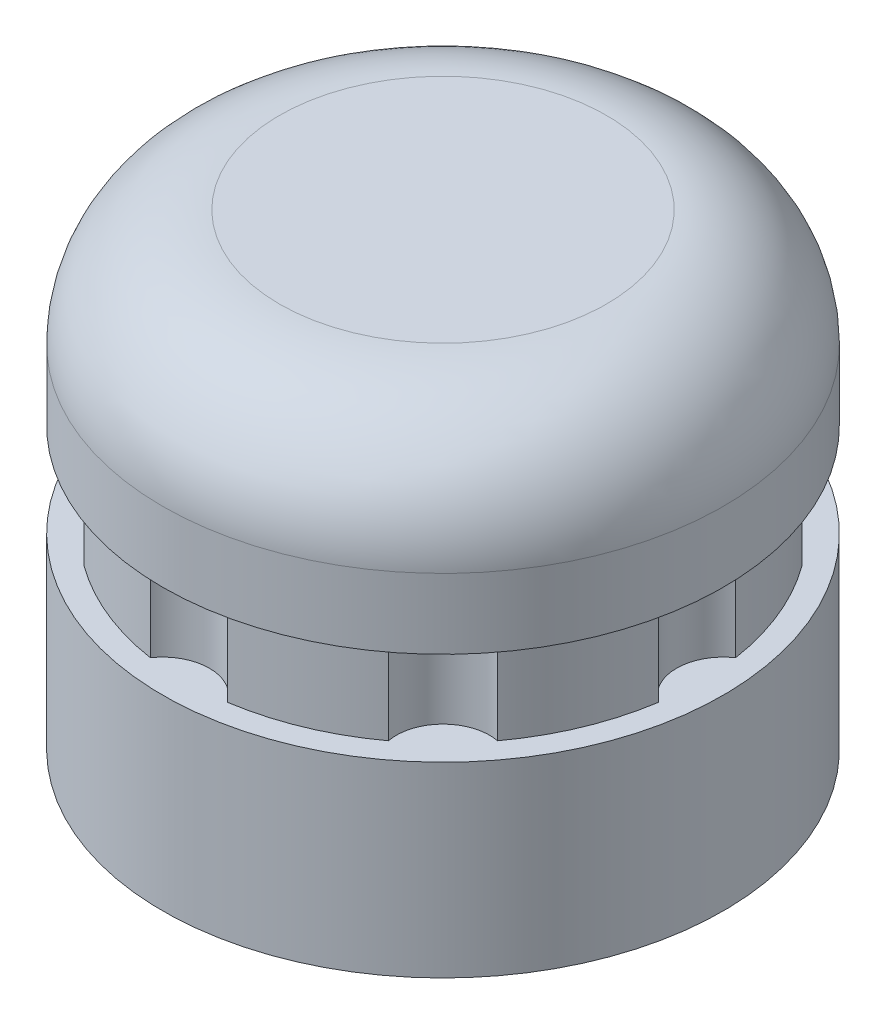
ISO-10303-21;
HEADER;
FILE_DESCRIPTION(('STEP AP214'),'2;1');
FILE_NAME('part.step','',(''),(''),'','','');
FILE_SCHEMA(('AUTOMOTIVE_DESIGN { 1 0 10303 214 1 1 1 1 }'));
ENDSEC;
DATA;
#1=APPLICATION_CONTEXT('core data for automotive mechanical design processes');
#2=APPLICATION_PROTOCOL_DEFINITION('international standard','automotive_design',2000,#1);
#3=PRODUCT_CONTEXT('',#1,'mechanical');
#4=PRODUCT('Part','Part','',(#3));
#5=PRODUCT_RELATED_PRODUCT_CATEGORY('part','',(#4));
#6=PRODUCT_DEFINITION_FORMATION('','',#4);
#7=PRODUCT_DEFINITION_CONTEXT('part definition',#1,'design');
#8=PRODUCT_DEFINITION('design','',#6,#7);
#9=PRODUCT_DEFINITION_SHAPE('','',#8);
#10=(LENGTH_UNIT() NAMED_UNIT(*) SI_UNIT(.MILLI.,.METRE.));
#11=(NAMED_UNIT(*) PLANE_ANGLE_UNIT() SI_UNIT($,.RADIAN.));
#12=(NAMED_UNIT(*) SI_UNIT($,.STERADIAN.) SOLID_ANGLE_UNIT());
#13=UNCERTAINTY_MEASURE_WITH_UNIT(LENGTH_MEASURE(1.E-05),#10,'distance_accuracy_value','');
#14=(GEOMETRIC_REPRESENTATION_CONTEXT(3) GLOBAL_UNCERTAINTY_ASSIGNED_CONTEXT((#13)) GLOBAL_UNIT_ASSIGNED_CONTEXT((#10,
#11,#12)) REPRESENTATION_CONTEXT('',''));
#15=CARTESIAN_POINT('',(0.,0.,0.));
#16=DIRECTION('',(0.,0.,1.));
#17=DIRECTION('',(1.,0.,0.));
#18=AXIS2_PLACEMENT_3D('',#15,#16,#17);
#19=CARTESIAN_POINT('',(0.,4.,0.));
#20=DIRECTION('',(0.,-1.,0.));
#21=DIRECTION('',(0.,0.,-1.));
#22=AXIS2_PLACEMENT_3D('',#19,#20,#21);
#23=PLANE('',#22);
#24=DIRECTION('',(0.,0.,1.));
#25=VECTOR('',#24,1.);
#26=CARTESIAN_POINT('',(1.5,4.,2.));
#27=LINE('',#26,#25);
#28=CARTESIAN_POINT('',(1.5,4.,-2.));
#29=VERTEX_POINT('',#28);
#30=CARTESIAN_POINT('',(1.5,4.,2.));
#31=VERTEX_POINT('',#30);
#32=EDGE_CURVE('E198',#29,#31,#27,.T.);
#33=ORIENTED_EDGE('',*,*,#32,.F.);
#34=CARTESIAN_POINT('',(0.,4.,0.));
#35=DIRECTION('',(0.,-1.,0.));
#36=DIRECTION('',(0.,0.,-1.));
#37=AXIS2_PLACEMENT_3D('',#34,#35,#36);
#38=CIRCLE('',#37,2.5);
#39=EDGE_CURVE('E180',#29,#31,#38,.T.);
#40=ORIENTED_EDGE('',*,*,#39,.T.);
#41=EDGE_LOOP('',(#33,#40));
#42=FACE_BOUND('',#41,.T.);
#43=ADVANCED_FACE('F34',(#42),#23,.T.);
#44=CARTESIAN_POINT('',(0.,20.,0.));
#45=DIRECTION('',(0.,-1.,0.));
#46=DIRECTION('',(0.,0.,-1.));
#47=AXIS2_PLACEMENT_3D('',#44,#45,#46);
#48=CYLINDRICAL_SURFACE('',#47,11.);
#49=CARTESIAN_POINT('',(0.,12.,0.));
#50=DIRECTION('',(0.,1.,0.));
#51=DIRECTION('',(0.,0.,1.));
#52=AXIS2_PLACEMENT_3D('',#49,#50,#51);
#53=CIRCLE('',#52,11.);
#54=CARTESIAN_POINT('',(-6.52051831203686,12.,8.85905417877055));
#55=VERTEX_POINT('',#54);
#56=CARTESIAN_POINT('',(-1.65359456941537,12.,10.875));
#57=VERTEX_POINT('',#56);
#58=EDGE_CURVE('E288',#55,#57,#53,.T.);
#59=ORIENTED_EDGE('',*,*,#58,.F.);
#60=DIRECTION('',(0.,-1.,0.));
#61=VECTOR('',#60,1.);
#62=CARTESIAN_POINT('',(-6.52051831203686,20.,8.85905417877055));
#63=LINE('',#62,#61);
#64=CARTESIAN_POINT('',(-6.52051831203686,8.,8.85905417877055));
#65=VERTEX_POINT('',#64);
#66=EDGE_CURVE('E341',#55,#65,#63,.T.);
#67=ORIENTED_EDGE('',*,*,#66,.T.);
#68=CARTESIAN_POINT('',(0.,8.,0.));
#69=DIRECTION('',(0.,-1.,0.));
#70=DIRECTION('',(0.,0.,-1.));
#71=AXIS2_PLACEMENT_3D('',#68,#69,#70);
#72=CIRCLE('',#71,11.);
#73=CARTESIAN_POINT('',(-1.65359456941537,8.,10.875));
#74=VERTEX_POINT('',#73);
#75=EDGE_CURVE('E338',#74,#65,#72,.T.);
#76=ORIENTED_EDGE('',*,*,#75,.F.);
#77=DIRECTION('',(0.,-1.,0.));
#78=VECTOR('',#77,1.);
#79=CARTESIAN_POINT('',(-1.65359456941537,20.,10.875));
#80=LINE('',#79,#78);
#81=EDGE_CURVE('E223',#57,#74,#80,.T.);
#82=ORIENTED_EDGE('',*,*,#81,.F.);
#83=EDGE_LOOP('',(#59,#67,#76,#82));
#84=FACE_BOUND('',#83,.T.);
#85=ADVANCED_FACE('F383',(#84),#48,.T.);
#86=CARTESIAN_POINT('',(0.,20.,12.));
#87=DIRECTION('',(0.,-1.,0.));
#88=DIRECTION('',(0.,0.,-1.));
#89=AXIS2_PLACEMENT_3D('',#86,#87,#88);
#90=CYLINDRICAL_SURFACE('',#89,2.);
#91=DIRECTION('',(0.,-1.,0.));
#92=VECTOR('',#91,1.);
#93=CARTESIAN_POINT('',(1.65359456941537,20.,10.875));
#94=LINE('',#93,#92);
#95=CARTESIAN_POINT('',(1.65359456941537,12.,10.875));
#96=VERTEX_POINT('',#95);
#97=CARTESIAN_POINT('',(1.65359456941537,8.,10.875));
#98=VERTEX_POINT('',#97);
#99=EDGE_CURVE('E369',#96,#98,#94,.T.);
#100=ORIENTED_EDGE('',*,*,#99,.F.);
#101=CARTESIAN_POINT('',(0.,12.,12.));
#102=DIRECTION('',(0.,1.,0.));
#103=DIRECTION('',(0.,0.,1.));
#104=AXIS2_PLACEMENT_3D('',#101,#102,#103);
#105=CIRCLE('',#104,2.);
#106=EDGE_CURVE('E285',#96,#57,#105,.T.);
#107=ORIENTED_EDGE('',*,*,#106,.T.);
#108=ORIENTED_EDGE('',*,*,#81,.T.);
#109=CARTESIAN_POINT('',(0.,8.,12.));
#110=DIRECTION('',(0.,-1.,0.));
#111=DIRECTION('',(0.,0.,-1.));
#112=AXIS2_PLACEMENT_3D('',#109,#110,#111);
#113=CIRCLE('',#112,2.);
#114=EDGE_CURVE('E335',#74,#98,#113,.T.);
#115=ORIENTED_EDGE('',*,*,#114,.T.);
#116=EDGE_LOOP('',(#100,#107,#108,#115));
#117=FACE_BOUND('',#116,.T.);
#118=ADVANCED_FACE('F374',(#117),#90,.F.);
#119=CARTESIAN_POINT('',(0.,12.,0.));
#120=DIRECTION('',(0.,1.,0.));
#121=DIRECTION('',(0.,0.,1.));
#122=AXIS2_PLACEMENT_3D('',#119,#120,#121);
#123=CIRCLE('',#122,11.);
#124=CARTESIAN_POINT('',(6.52051831203674,12.,8.85905417877064));
#125=VERTEX_POINT('',#124);
#126=EDGE_CURVE('E283',#96,#125,#123,.T.);
#127=ORIENTED_EDGE('',*,*,#126,.F.);
#128=ORIENTED_EDGE('',*,*,#99,.T.);
#129=CARTESIAN_POINT('',(0.,8.,0.));
#130=DIRECTION('',(0.,-1.,0.));
#131=DIRECTION('',(0.,0.,-1.));
#132=AXIS2_PLACEMENT_3D('',#129,#130,#131);
#133=CIRCLE('',#132,11.);
#134=CARTESIAN_POINT('',(6.52051831203674,8.,8.85905417877064));
#135=VERTEX_POINT('',#134);
#136=EDGE_CURVE('E332',#135,#98,#133,.T.);
#137=ORIENTED_EDGE('',*,*,#136,.F.);
#138=DIRECTION('',(0.,-1.,0.));
#139=VECTOR('',#138,1.);
#140=CARTESIAN_POINT('',(6.52051831203674,20.,8.85905417877064));
#141=LINE('',#140,#139);
#142=EDGE_CURVE('E367',#125,#135,#141,.T.);
#143=ORIENTED_EDGE('',*,*,#142,.F.);
#144=EDGE_LOOP('',(#127,#128,#137,#143));
#145=FACE_BOUND('',#144,.T.);
#146=ADVANCED_FACE('F439',(#145),#48,.T.);
#147=CARTESIAN_POINT('',(8.48528137423847,20.,8.48528137423868));
#148=DIRECTION('',(0.,-1.,0.));
#149=DIRECTION('',(0.,0.,-1.));
#150=AXIS2_PLACEMENT_3D('',#147,#148,#149);
#151=CYLINDRICAL_SURFACE('',#150,2.);
#152=DIRECTION('',(0.,-1.,0.));
#153=VECTOR('',#152,1.);
#154=CARTESIAN_POINT('',(8.85905417877048,20.,6.52051831203696));
#155=LINE('',#154,#153);
#156=CARTESIAN_POINT('',(8.85905417877048,12.,6.52051831203696));
#157=VERTEX_POINT('',#156);
#158=CARTESIAN_POINT('',(8.85905417877048,8.,6.52051831203696));
#159=VERTEX_POINT('',#158);
#160=EDGE_CURVE('E365',#157,#159,#155,.T.);
#161=ORIENTED_EDGE('',*,*,#160,.F.);
#162=CARTESIAN_POINT('',(8.48528137423847,12.,8.48528137423868));
#163=DIRECTION('',(0.,1.,0.));
#164=DIRECTION('',(0.,0.,1.));
#165=AXIS2_PLACEMENT_3D('',#162,#163,#164);
#166=CIRCLE('',#165,2.);
#167=EDGE_CURVE('E280',#157,#125,#166,.T.);
#168=ORIENTED_EDGE('',*,*,#167,.T.);
#169=ORIENTED_EDGE('',*,*,#142,.T.);
#170=CARTESIAN_POINT('',(8.48528137423847,8.,8.48528137423868));
#171=DIRECTION('',(0.,-1.,0.));
#172=DIRECTION('',(0.,0.,-1.));
#173=AXIS2_PLACEMENT_3D('',#170,#171,#172);
#174=CIRCLE('',#173,2.);
#175=EDGE_CURVE('E329',#135,#159,#174,.T.);
#176=ORIENTED_EDGE('',*,*,#175,.T.);
#177=EDGE_LOOP('',(#161,#168,#169,#176));
#178=FACE_BOUND('',#177,.T.);
#179=ADVANCED_FACE('F435',(#178),#151,.F.);
#180=CARTESIAN_POINT('',(0.,12.,0.));
#181=DIRECTION('',(0.,1.,0.));
#182=DIRECTION('',(0.,0.,1.));
#183=AXIS2_PLACEMENT_3D('',#180,#181,#182);
#184=CIRCLE('',#183,11.);
#185=CARTESIAN_POINT('',(10.875,12.,1.65359456941548));
#186=VERTEX_POINT('',#185);
#187=EDGE_CURVE('E278',#157,#186,#184,.T.);
#188=ORIENTED_EDGE('',*,*,#187,.F.);
#189=ORIENTED_EDGE('',*,*,#160,.T.);
#190=CARTESIAN_POINT('',(0.,8.,0.));
#191=DIRECTION('',(0.,-1.,0.));
#192=DIRECTION('',(0.,0.,-1.));
#193=AXIS2_PLACEMENT_3D('',#190,#191,#192);
#194=CIRCLE('',#193,11.);
#195=CARTESIAN_POINT('',(10.875,8.,1.65359456941548));
#196=VERTEX_POINT('',#195);
#197=EDGE_CURVE('E326',#196,#159,#194,.T.);
#198=ORIENTED_EDGE('',*,*,#197,.F.);
#199=DIRECTION('',(0.,-1.,0.));
#200=VECTOR('',#199,1.);
#201=CARTESIAN_POINT('',(10.875,20.,1.65359456941548));
#202=LINE('',#201,#200);
#203=EDGE_CURVE('E363',#186,#196,#202,.T.);
#204=ORIENTED_EDGE('',*,*,#203,.F.);
#205=EDGE_LOOP('',(#188,#189,#198,#204));
#206=FACE_BOUND('',#205,.T.);
#207=ADVANCED_FACE('F432',(#206),#48,.T.);
#208=CARTESIAN_POINT('',(12.,20.,1.25693328198353E-13));
#209=DIRECTION('',(0.,-1.,0.));
#210=DIRECTION('',(0.,0.,-1.));
#211=AXIS2_PLACEMENT_3D('',#208,#209,#210);
#212=CYLINDRICAL_SURFACE('',#211,2.);
#213=DIRECTION('',(0.,-1.,0.));
#214=VECTOR('',#213,1.);
#215=CARTESIAN_POINT('',(10.875,20.,-1.65359456941525));
#216=LINE('',#215,#214);
#217=CARTESIAN_POINT('',(10.875,12.,-1.65359456941525));
#218=VERTEX_POINT('',#217);
#219=CARTESIAN_POINT('',(10.875,8.,-1.65359456941525));
#220=VERTEX_POINT('',#219);
#221=EDGE_CURVE('E361',#218,#220,#216,.T.);
#222=ORIENTED_EDGE('',*,*,#221,.F.);
#223=CARTESIAN_POINT('',(12.,12.,1.25693328198353E-13));
#224=DIRECTION('',(0.,1.,0.));
#225=DIRECTION('',(0.,0.,1.));
#226=AXIS2_PLACEMENT_3D('',#223,#224,#225);
#227=CIRCLE('',#226,2.);
#228=EDGE_CURVE('E275',#218,#186,#227,.T.);
#229=ORIENTED_EDGE('',*,*,#228,.T.);
#230=ORIENTED_EDGE('',*,*,#203,.T.);
#231=CARTESIAN_POINT('',(12.,8.,1.25693328198353E-13));
#232=DIRECTION('',(0.,-1.,0.));
#233=DIRECTION('',(0.,0.,-1.));
#234=AXIS2_PLACEMENT_3D('',#231,#232,#233);
#235=CIRCLE('',#234,2.);
#236=EDGE_CURVE('E323',#196,#220,#235,.T.);
#237=ORIENTED_EDGE('',*,*,#236,.T.);
#238=EDGE_LOOP('',(#222,#229,#230,#237));
#239=FACE_BOUND('',#238,.T.);
#240=ADVANCED_FACE('F427',(#239),#212,.F.);
#241=CARTESIAN_POINT('',(0.,12.,0.));
#242=DIRECTION('',(0.,1.,0.));
#243=DIRECTION('',(0.,0.,1.));
#244=AXIS2_PLACEMENT_3D('',#241,#242,#243);
#245=CIRCLE('',#244,11.);
#246=CARTESIAN_POINT('',(8.85905417877062,12.,-6.52051831203677));
#247=VERTEX_POINT('',#246);
#248=EDGE_CURVE('E273',#218,#247,#245,.T.);
#249=ORIENTED_EDGE('',*,*,#248,.F.);
#250=ORIENTED_EDGE('',*,*,#221,.T.);
#251=CARTESIAN_POINT('',(0.,8.,0.));
#252=DIRECTION('',(0.,-1.,0.));
#253=DIRECTION('',(0.,0.,-1.));
#254=AXIS2_PLACEMENT_3D('',#251,#252,#253);
#255=CIRCLE('',#254,11.);
#256=CARTESIAN_POINT('',(8.85905417877062,8.,-6.52051831203677));
#257=VERTEX_POINT('',#256);
#258=EDGE_CURVE('E320',#257,#220,#255,.T.);
#259=ORIENTED_EDGE('',*,*,#258,.F.);
#260=DIRECTION('',(0.,-1.,0.));
#261=VECTOR('',#260,1.);
#262=CARTESIAN_POINT('',(8.85905417877062,20.,-6.52051831203677));
#263=LINE('',#262,#261);
#264=EDGE_CURVE('E359',#247,#257,#263,.T.);
#265=ORIENTED_EDGE('',*,*,#264,.F.);
#266=EDGE_LOOP('',(#249,#250,#259,#265));
#267=FACE_BOUND('',#266,.T.);
#268=ADVANCED_FACE('F424',(#267),#48,.T.);
#269=CARTESIAN_POINT('',(8.48528137423865,20.,-8.4852813742385));
#270=DIRECTION('',(0.,-1.,0.));
#271=DIRECTION('',(0.,0.,-1.));
#272=AXIS2_PLACEMENT_3D('',#269,#270,#271);
#273=CYLINDRICAL_SURFACE('',#272,2.);
#274=DIRECTION('',(0.,-1.,0.));
#275=VECTOR('',#274,1.);
#276=CARTESIAN_POINT('',(6.52051831203693,20.,-8.8590541787705));
#277=LINE('',#276,#275);
#278=CARTESIAN_POINT('',(6.52051831203693,12.,-8.8590541787705));
#279=VERTEX_POINT('',#278);
#280=CARTESIAN_POINT('',(6.52051831203693,8.,-8.8590541787705));
#281=VERTEX_POINT('',#280);
#282=EDGE_CURVE('E357',#279,#281,#277,.T.);
#283=ORIENTED_EDGE('',*,*,#282,.F.);
#284=CARTESIAN_POINT('',(8.48528137423865,12.,-8.4852813742385));
#285=DIRECTION('',(0.,1.,0.));
#286=DIRECTION('',(0.,0.,1.));
#287=AXIS2_PLACEMENT_3D('',#284,#285,#286);
#288=CIRCLE('',#287,2.);
#289=EDGE_CURVE('E270',#279,#247,#288,.T.);
#290=ORIENTED_EDGE('',*,*,#289,.T.);
#291=ORIENTED_EDGE('',*,*,#264,.T.);
#292=CARTESIAN_POINT('',(8.48528137423865,8.,-8.4852813742385));
#293=DIRECTION('',(0.,-1.,0.));
#294=DIRECTION('',(0.,0.,-1.));
#295=AXIS2_PLACEMENT_3D('',#292,#293,#294);
#296=CIRCLE('',#295,2.);
#297=EDGE_CURVE('E317',#257,#281,#296,.T.);
#298=ORIENTED_EDGE('',*,*,#297,.T.);
#299=EDGE_LOOP('',(#283,#290,#291,#298));
#300=FACE_BOUND('',#299,.T.);
#301=ADVANCED_FACE('F418',(#300),#273,.F.);
#302=CARTESIAN_POINT('',(0.,12.,0.));
#303=DIRECTION('',(0.,1.,0.));
#304=DIRECTION('',(0.,0.,1.));
#305=AXIS2_PLACEMENT_3D('',#302,#303,#304);
#306=CIRCLE('',#305,11.);
#307=CARTESIAN_POINT('',(1.65359456941544,12.,-10.875));
#308=VERTEX_POINT('',#307);
#309=EDGE_CURVE('E268',#279,#308,#306,.T.);
#310=ORIENTED_EDGE('',*,*,#309,.F.);
#311=ORIENTED_EDGE('',*,*,#282,.T.);
#312=CARTESIAN_POINT('',(0.,8.,0.));
#313=DIRECTION('',(0.,-1.,0.));
#314=DIRECTION('',(0.,0.,-1.));
#315=AXIS2_PLACEMENT_3D('',#312,#313,#314);
#316=CIRCLE('',#315,11.);
#317=CARTESIAN_POINT('',(1.65359456941544,8.,-10.875));
#318=VERTEX_POINT('',#317);
#319=EDGE_CURVE('E314',#318,#281,#316,.T.);
#320=ORIENTED_EDGE('',*,*,#319,.F.);
#321=DIRECTION('',(0.,-1.,0.));
#322=VECTOR('',#321,1.);
#323=CARTESIAN_POINT('',(1.65359456941544,20.,-10.875));
#324=LINE('',#323,#322);
#325=EDGE_CURVE('E355',#308,#318,#324,.T.);
#326=ORIENTED_EDGE('',*,*,#325,.F.);
#327=EDGE_LOOP('',(#310,#311,#320,#326));
#328=FACE_BOUND('',#327,.T.);
#329=ADVANCED_FACE('F415',(#328),#48,.T.);
#330=CARTESIAN_POINT('',(0.,20.,-12.));
#331=DIRECTION('',(0.,-1.,0.));
#332=DIRECTION('',(0.,0.,-1.));
#333=AXIS2_PLACEMENT_3D('',#330,#331,#332);
#334=CYLINDRICAL_SURFACE('',#333,2.);
#335=DIRECTION('',(0.,-1.,0.));
#336=VECTOR('',#335,1.);
#337=CARTESIAN_POINT('',(-1.65359456941529,20.,-10.875));
#338=LINE('',#337,#336);
#339=CARTESIAN_POINT('',(-1.65359456941529,12.,-10.875));
#340=VERTEX_POINT('',#339);
#341=CARTESIAN_POINT('',(-1.65359456941529,8.,-10.875));
#342=VERTEX_POINT('',#341);
#343=EDGE_CURVE('E353',#340,#342,#338,.T.);
#344=ORIENTED_EDGE('',*,*,#343,.F.);
#345=CARTESIAN_POINT('',(0.,12.,-12.));
#346=DIRECTION('',(0.,1.,0.));
#347=DIRECTION('',(0.,0.,1.));
#348=AXIS2_PLACEMENT_3D('',#345,#346,#347);
#349=CIRCLE('',#348,2.);
#350=EDGE_CURVE('E265',#340,#308,#349,.T.);
#351=ORIENTED_EDGE('',*,*,#350,.T.);
#352=ORIENTED_EDGE('',*,*,#325,.T.);
#353=CARTESIAN_POINT('',(0.,8.,-12.));
#354=DIRECTION('',(0.,-1.,0.));
#355=DIRECTION('',(0.,0.,-1.));
#356=AXIS2_PLACEMENT_3D('',#353,#354,#355);
#357=CIRCLE('',#356,2.);
#358=EDGE_CURVE('E311',#318,#342,#357,.T.);
#359=ORIENTED_EDGE('',*,*,#358,.T.);
#360=EDGE_LOOP('',(#344,#351,#352,#359));
#361=FACE_BOUND('',#360,.T.);
#362=ADVANCED_FACE('F409',(#361),#334,.F.);
#363=CARTESIAN_POINT('',(0.,12.,0.));
#364=DIRECTION('',(0.,1.,0.));
#365=DIRECTION('',(0.,0.,1.));
#366=AXIS2_PLACEMENT_3D('',#363,#364,#365);
#367=CIRCLE('',#366,11.);
#368=CARTESIAN_POINT('',(-6.5205183120368,12.,-8.8590541787706));
#369=VERTEX_POINT('',#368);
#370=EDGE_CURVE('E263',#340,#369,#367,.T.);
#371=ORIENTED_EDGE('',*,*,#370,.F.);
#372=ORIENTED_EDGE('',*,*,#343,.T.);
#373=CARTESIAN_POINT('',(0.,8.,0.));
#374=DIRECTION('',(0.,-1.,0.));
#375=DIRECTION('',(0.,0.,-1.));
#376=AXIS2_PLACEMENT_3D('',#373,#374,#375);
#377=CIRCLE('',#376,11.);
#378=CARTESIAN_POINT('',(-6.5205183120368,8.,-8.8590541787706));
#379=VERTEX_POINT('',#378);
#380=EDGE_CURVE('E308',#379,#342,#377,.T.);
#381=ORIENTED_EDGE('',*,*,#380,.F.);
#382=DIRECTION('',(0.,-1.,0.));
#383=VECTOR('',#382,1.);
#384=CARTESIAN_POINT('',(-6.5205183120368,20.,-8.8590541787706));
#385=LINE('',#384,#383);
#386=EDGE_CURVE('E351',#369,#379,#385,.T.);
#387=ORIENTED_EDGE('',*,*,#386,.F.);
#388=EDGE_LOOP('',(#371,#372,#381,#387));
#389=FACE_BOUND('',#388,.T.);
#390=ADVANCED_FACE('F406',(#389),#48,.T.);
#391=CARTESIAN_POINT('',(-8.48528137423852,20.,-8.48528137423862));
#392=DIRECTION('',(0.,-1.,0.));
#393=DIRECTION('',(0.,0.,-1.));
#394=AXIS2_PLACEMENT_3D('',#391,#392,#393);
#395=CYLINDRICAL_SURFACE('',#394,2.);
#396=DIRECTION('',(0.,-1.,0.));
#397=VECTOR('',#396,1.);
#398=CARTESIAN_POINT('',(-8.85905417877052,20.,-6.5205183120369));
#399=LINE('',#398,#397);
#400=CARTESIAN_POINT('',(-8.85905417877052,12.,-6.5205183120369));
#401=VERTEX_POINT('',#400);
#402=CARTESIAN_POINT('',(-8.85905417877052,8.,-6.5205183120369));
#403=VERTEX_POINT('',#402);
#404=EDGE_CURVE('E349',#401,#403,#399,.T.);
#405=ORIENTED_EDGE('',*,*,#404,.F.);
#406=CARTESIAN_POINT('',(-8.48528137423852,12.,-8.48528137423862));
#407=DIRECTION('',(0.,1.,0.));
#408=DIRECTION('',(0.,0.,1.));
#409=AXIS2_PLACEMENT_3D('',#406,#407,#408);
#410=CIRCLE('',#409,2.);
#411=EDGE_CURVE('E260',#401,#369,#410,.T.);
#412=ORIENTED_EDGE('',*,*,#411,.T.);
#413=ORIENTED_EDGE('',*,*,#386,.T.);
#414=CARTESIAN_POINT('',(-8.48528137423852,8.,-8.48528137423862));
#415=DIRECTION('',(0.,-1.,0.));
#416=DIRECTION('',(0.,0.,-1.));
#417=AXIS2_PLACEMENT_3D('',#414,#415,#416);
#418=CIRCLE('',#417,2.);
#419=EDGE_CURVE('E305',#379,#403,#418,.T.);
#420=ORIENTED_EDGE('',*,*,#419,.T.);
#421=EDGE_LOOP('',(#405,#412,#413,#420));
#422=FACE_BOUND('',#421,.T.);
#423=ADVANCED_FACE('F400',(#422),#395,.F.);
#424=CARTESIAN_POINT('',(0.,12.,0.));
#425=DIRECTION('',(0.,1.,0.));
#426=DIRECTION('',(0.,0.,1.));
#427=AXIS2_PLACEMENT_3D('',#424,#425,#426);
#428=CIRCLE('',#427,11.);
#429=CARTESIAN_POINT('',(-10.875,12.,-1.65359456941541));
#430=VERTEX_POINT('',#429);
#431=EDGE_CURVE('E258',#401,#430,#428,.T.);
#432=ORIENTED_EDGE('',*,*,#431,.F.);
#433=ORIENTED_EDGE('',*,*,#404,.T.);
#434=CARTESIAN_POINT('',(0.,8.,0.));
#435=DIRECTION('',(0.,-1.,0.));
#436=DIRECTION('',(0.,0.,-1.));
#437=AXIS2_PLACEMENT_3D('',#434,#435,#436);
#438=CIRCLE('',#437,11.);
#439=CARTESIAN_POINT('',(-10.875,8.,-1.65359456941541));
#440=VERTEX_POINT('',#439);
#441=EDGE_CURVE('E302',#440,#403,#438,.T.);
#442=ORIENTED_EDGE('',*,*,#441,.F.);
#443=DIRECTION('',(0.,-1.,0.));
#444=VECTOR('',#443,1.);
#445=CARTESIAN_POINT('',(-10.875,20.,-1.65359456941541));
#446=LINE('',#445,#444);
#447=EDGE_CURVE('E347',#430,#440,#446,.T.);
#448=ORIENTED_EDGE('',*,*,#447,.F.);
#449=EDGE_LOOP('',(#432,#433,#442,#448));
#450=FACE_BOUND('',#449,.T.);
#451=ADVANCED_FACE('F397',(#450),#48,.T.);
#452=CARTESIAN_POINT('',(-12.,20.,0.));
#453=DIRECTION('',(0.,-1.,0.));
#454=DIRECTION('',(0.,0.,-1.));
#455=AXIS2_PLACEMENT_3D('',#452,#453,#454);
#456=CYLINDRICAL_SURFACE('',#455,2.);
#457=DIRECTION('',(0.,-1.,0.));
#458=VECTOR('',#457,1.);
#459=CARTESIAN_POINT('',(-10.875,20.,1.65359456941533));
#460=LINE('',#459,#458);
#461=CARTESIAN_POINT('',(-10.875,12.,1.65359456941533));
#462=VERTEX_POINT('',#461);
#463=CARTESIAN_POINT('',(-10.875,8.,1.65359456941533));
#464=VERTEX_POINT('',#463);
#465=EDGE_CURVE('E345',#462,#464,#460,.T.);
#466=ORIENTED_EDGE('',*,*,#465,.F.);
#467=CARTESIAN_POINT('',(-12.,12.,0.));
#468=DIRECTION('',(0.,1.,0.));
#469=DIRECTION('',(0.,0.,1.));
#470=AXIS2_PLACEMENT_3D('',#467,#468,#469);
#471=CIRCLE('',#470,2.);
#472=EDGE_CURVE('E255',#462,#430,#471,.T.);
#473=ORIENTED_EDGE('',*,*,#472,.T.);
#474=ORIENTED_EDGE('',*,*,#447,.T.);
#475=CARTESIAN_POINT('',(-12.,8.,0.));
#476=DIRECTION('',(0.,-1.,0.));
#477=DIRECTION('',(0.,0.,-1.));
#478=AXIS2_PLACEMENT_3D('',#475,#476,#477);
#479=CIRCLE('',#478,2.);
#480=EDGE_CURVE('E299',#440,#464,#479,.T.);
#481=ORIENTED_EDGE('',*,*,#480,.T.);
#482=EDGE_LOOP('',(#466,#473,#474,#481));
#483=FACE_BOUND('',#482,.T.);
#484=ADVANCED_FACE('F391',(#483),#456,.F.);
#485=CARTESIAN_POINT('',(0.,12.,0.));
#486=DIRECTION('',(0.,1.,0.));
#487=DIRECTION('',(0.,0.,1.));
#488=AXIS2_PLACEMENT_3D('',#485,#486,#487);
#489=CIRCLE('',#488,11.);
#490=CARTESIAN_POINT('',(-8.85905417877057,12.,6.52051831203683));
#491=VERTEX_POINT('',#490);
#492=EDGE_CURVE('E57',#462,#491,#489,.T.);
#493=ORIENTED_EDGE('',*,*,#492,.F.);
#494=ORIENTED_EDGE('',*,*,#465,.T.);
#495=CARTESIAN_POINT('',(0.,8.,0.));
#496=DIRECTION('',(0.,-1.,0.));
#497=DIRECTION('',(0.,0.,-1.));
#498=AXIS2_PLACEMENT_3D('',#495,#496,#497);
#499=CIRCLE('',#498,11.);
#500=CARTESIAN_POINT('',(-8.85905417877057,8.,6.52051831203683));
#501=VERTEX_POINT('',#500);
#502=EDGE_CURVE('E294',#501,#464,#499,.T.);
#503=ORIENTED_EDGE('',*,*,#502,.F.);
#504=DIRECTION('',(0.,-1.,0.));
#505=VECTOR('',#504,1.);
#506=CARTESIAN_POINT('',(-8.85905417877057,20.,6.52051831203683));
#507=LINE('',#506,#505);
#508=EDGE_CURVE('E343',#491,#501,#507,.T.);
#509=ORIENTED_EDGE('',*,*,#508,.F.);
#510=EDGE_LOOP('',(#493,#494,#503,#509));
#511=FACE_BOUND('',#510,.T.);
#512=ADVANCED_FACE('F388',(#511),#48,.T.);
#513=CARTESIAN_POINT('',(-8.48528137423859,20.,8.48528137423856));
#514=DIRECTION('',(0.,-1.,0.));
#515=DIRECTION('',(0.,0.,-1.));
#516=AXIS2_PLACEMENT_3D('',#513,#514,#515);
#517=CYLINDRICAL_SURFACE('',#516,2.);
#518=ORIENTED_EDGE('',*,*,#66,.F.);
#519=CARTESIAN_POINT('',(-8.48528137423859,12.,8.48528137423856));
#520=DIRECTION('',(0.,1.,0.));
#521=DIRECTION('',(0.,0.,1.));
#522=AXIS2_PLACEMENT_3D('',#519,#520,#521);
#523=CIRCLE('',#522,2.);
#524=EDGE_CURVE('E214',#55,#491,#523,.T.);
#525=ORIENTED_EDGE('',*,*,#524,.T.);
#526=ORIENTED_EDGE('',*,*,#508,.T.);
#527=CARTESIAN_POINT('',(-8.48528137423859,8.,8.48528137423856));
#528=DIRECTION('',(0.,-1.,0.));
#529=DIRECTION('',(0.,0.,-1.));
#530=AXIS2_PLACEMENT_3D('',#527,#528,#529);
#531=CIRCLE('',#530,2.);
#532=EDGE_CURVE('E217',#501,#65,#531,.T.);
#533=ORIENTED_EDGE('',*,*,#532,.T.);
#534=EDGE_LOOP('',(#518,#525,#526,#533));
#535=FACE_BOUND('',#534,.T.);
#536=ADVANCED_FACE('F384',(#535),#517,.F.);
#537=CARTESIAN_POINT('',(0.,8.,0.));
#538=DIRECTION('',(0.,-1.,0.));
#539=DIRECTION('',(0.,0.,-1.));
#540=AXIS2_PLACEMENT_3D('',#537,#538,#539);
#541=PLANE('',#540);
#542=CARTESIAN_POINT('',(0.,8.,0.));
#543=DIRECTION('',(0.,-1.,0.));
#544=DIRECTION('',(0.,0.,-1.));
#545=AXIS2_PLACEMENT_3D('',#542,#543,#544);
#546=CIRCLE('',#545,12.);
#547=CARTESIAN_POINT('',(0.,8.,-12.));
#548=VERTEX_POINT('',#547);
#549=EDGE_CURVE('E291',#548,#548,#546,.T.);
#550=ORIENTED_EDGE('',*,*,#549,.F.);
#551=EDGE_LOOP('',(#550));
#552=FACE_BOUND('',#551,.T.);
#553=ORIENTED_EDGE('',*,*,#114,.F.);
#554=ORIENTED_EDGE('',*,*,#75,.T.);
#555=ORIENTED_EDGE('',*,*,#532,.F.);
#556=ORIENTED_EDGE('',*,*,#502,.T.);
#557=ORIENTED_EDGE('',*,*,#480,.F.);
#558=ORIENTED_EDGE('',*,*,#441,.T.);
#559=ORIENTED_EDGE('',*,*,#419,.F.);
#560=ORIENTED_EDGE('',*,*,#380,.T.);
#561=ORIENTED_EDGE('',*,*,#358,.F.);
#562=ORIENTED_EDGE('',*,*,#319,.T.);
#563=ORIENTED_EDGE('',*,*,#297,.F.);
#564=ORIENTED_EDGE('',*,*,#258,.T.);
#565=ORIENTED_EDGE('',*,*,#236,.F.);
#566=ORIENTED_EDGE('',*,*,#197,.T.);
#567=ORIENTED_EDGE('',*,*,#175,.F.);
#568=ORIENTED_EDGE('',*,*,#136,.T.);
#569=EDGE_LOOP('',(#553,#554,#555,#556,#557,#558,#559,#560,#561,#562,#563,#564,#565,#566,#567,#568));
#570=FACE_BOUND('',#569,.T.);
#571=ADVANCED_FACE('F379',(#552,#570),#541,.F.);
#572=CARTESIAN_POINT('',(0.,8.,0.));
#573=DIRECTION('',(0.,-1.,0.));
#574=DIRECTION('',(0.,0.,-1.));
#575=AXIS2_PLACEMENT_3D('',#572,#573,#574);
#576=CYLINDRICAL_SURFACE('',#575,12.);
#577=ORIENTED_EDGE('',*,*,#549,.T.);
#578=EDGE_LOOP('',(#577));
#579=FACE_BOUND('',#578,.T.);
#580=CARTESIAN_POINT('',(0.,0.,0.));
#581=DIRECTION('',(0.,-1.,0.));
#582=DIRECTION('',(0.,0.,-1.));
#583=AXIS2_PLACEMENT_3D('',#580,#581,#582);
#584=CIRCLE('',#583,12.);
#585=CARTESIAN_POINT('',(0.,0.,-12.));
#586=VERTEX_POINT('',#585);
#587=EDGE_CURVE('E290',#586,#586,#584,.T.);
#588=ORIENTED_EDGE('',*,*,#587,.F.);
#589=EDGE_LOOP('',(#588));
#590=FACE_BOUND('',#589,.T.);
#591=ADVANCED_FACE('F453',(#579,#590),#576,.T.);
#592=CARTESIAN_POINT('',(0.,0.,0.));
#593=DIRECTION('',(0.,1.,0.));
#594=DIRECTION('',(0.,0.,1.));
#595=AXIS2_PLACEMENT_3D('',#592,#593,#594);
#596=PLANE('',#595);
#597=CARTESIAN_POINT('',(0.,0.,0.));
#598=DIRECTION('',(0.,-1.,0.));
#599=DIRECTION('',(0.,0.,-1.));
#600=AXIS2_PLACEMENT_3D('',#597,#598,#599);
#601=CIRCLE('',#600,5.);
#602=CARTESIAN_POINT('',(0.,0.,-5.));
#603=VERTEX_POINT('',#602);
#604=EDGE_CURVE('E228',#603,#603,#601,.T.);
#605=ORIENTED_EDGE('',*,*,#604,.F.);
#606=EDGE_LOOP('',(#605));
#607=FACE_BOUND('',#606,.T.);
#608=ORIENTED_EDGE('',*,*,#587,.T.);
#609=EDGE_LOOP('',(#608));
#610=FACE_BOUND('',#609,.T.);
#611=ADVANCED_FACE('F443',(#607,#610),#596,.F.);
#612=CARTESIAN_POINT('',(0.,12.,0.));
#613=DIRECTION('',(0.,1.,0.));
#614=DIRECTION('',(0.,0.,1.));
#615=AXIS2_PLACEMENT_3D('',#612,#613,#614);
#616=PLANE('',#615);
#617=CARTESIAN_POINT('',(0.,12.,0.));
#618=DIRECTION('',(0.,1.,0.));
#619=DIRECTION('',(0.,0.,1.));
#620=AXIS2_PLACEMENT_3D('',#617,#618,#619);
#621=CIRCLE('',#620,12.);
#622=CARTESIAN_POINT('',(0.,12.,12.));
#623=VERTEX_POINT('',#622);
#624=EDGE_CURVE('E249',#623,#623,#621,.T.);
#625=ORIENTED_EDGE('',*,*,#624,.F.);
#626=EDGE_LOOP('',(#625));
#627=FACE_BOUND('',#626,.T.);
#628=ORIENTED_EDGE('',*,*,#524,.F.);
#629=ORIENTED_EDGE('',*,*,#58,.T.);
#630=ORIENTED_EDGE('',*,*,#106,.F.);
#631=ORIENTED_EDGE('',*,*,#126,.T.);
#632=ORIENTED_EDGE('',*,*,#167,.F.);
#633=ORIENTED_EDGE('',*,*,#187,.T.);
#634=ORIENTED_EDGE('',*,*,#228,.F.);
#635=ORIENTED_EDGE('',*,*,#248,.T.);
#636=ORIENTED_EDGE('',*,*,#289,.F.);
#637=ORIENTED_EDGE('',*,*,#309,.T.);
#638=ORIENTED_EDGE('',*,*,#350,.F.);
#639=ORIENTED_EDGE('',*,*,#370,.T.);
#640=ORIENTED_EDGE('',*,*,#411,.F.);
#641=ORIENTED_EDGE('',*,*,#431,.T.);
#642=ORIENTED_EDGE('',*,*,#472,.F.);
#643=ORIENTED_EDGE('',*,*,#492,.T.);
#644=EDGE_LOOP('',(#628,#629,#630,#631,#632,#633,#634,#635,#636,#637,#638,#639,#640,#641,#642,#643));
#645=FACE_BOUND('',#644,.T.);
#646=ADVANCED_FACE('F440',(#627,#645),#616,.F.);
#647=CARTESIAN_POINT('',(0.,12.,0.));
#648=DIRECTION('',(0.,1.,0.));
#649=DIRECTION('',(0.,0.,1.));
#650=AXIS2_PLACEMENT_3D('',#647,#648,#649);
#651=CYLINDRICAL_SURFACE('',#650,12.);
#652=CARTESIAN_POINT('',(0.,15.,0.));
#653=DIRECTION('',(0.,1.,0.));
#654=DIRECTION('',(0.,0.,1.));
#655=AXIS2_PLACEMENT_3D('',#652,#653,#654);
#656=CIRCLE('',#655,12.);
#657=CARTESIAN_POINT('',(0.,15.,12.));
#658=VERTEX_POINT('',#657);
#659=EDGE_CURVE('E11',#658,#658,#656,.F.);
#660=ORIENTED_EDGE('',*,*,#659,.T.);
#661=EDGE_LOOP('',(#660));
#662=FACE_BOUND('',#661,.T.);
#663=ORIENTED_EDGE('',*,*,#624,.T.);
#664=EDGE_LOOP('',(#663));
#665=FACE_BOUND('',#664,.T.);
#666=ADVANCED_FACE('F442',(#662,#665),#651,.T.);
#667=CARTESIAN_POINT('',(0.,20.,0.));
#668=DIRECTION('',(0.,1.,0.));
#669=DIRECTION('',(0.,0.,1.));
#670=AXIS2_PLACEMENT_3D('',#667,#668,#669);
#671=PLANE('',#670);
#672=CARTESIAN_POINT('',(0.,20.,0.));
#673=DIRECTION('',(0.,1.,0.));
#674=DIRECTION('',(0.,0.,1.));
#675=AXIS2_PLACEMENT_3D('',#672,#673,#674);
#676=CIRCLE('',#675,7.);
#677=CARTESIAN_POINT('',(0.,20.,7.));
#678=VERTEX_POINT('',#677);
#679=EDGE_CURVE('E42',#678,#678,#676,.T.);
#680=ORIENTED_EDGE('',*,*,#679,.T.);
#681=EDGE_LOOP('',(#680));
#682=FACE_BOUND('',#681,.T.);
#683=ADVANCED_FACE('F450',(#682),#671,.T.);
#684=CARTESIAN_POINT('',(0.,2.,0.));
#685=DIRECTION('',(0.,-1.,0.));
#686=DIRECTION('',(0.,0.,-1.));
#687=AXIS2_PLACEMENT_3D('',#684,#685,#686);
#688=CYLINDRICAL_SURFACE('',#687,5.);
#689=CARTESIAN_POINT('',(0.,2.,0.));
#690=DIRECTION('',(0.,-1.,0.));
#691=DIRECTION('',(0.,0.,-1.));
#692=AXIS2_PLACEMENT_3D('',#689,#690,#691);
#693=CIRCLE('',#692,5.);
#694=CARTESIAN_POINT('',(0.,2.,-5.));
#695=VERTEX_POINT('',#694);
#696=EDGE_CURVE('E246',#695,#695,#693,.T.);
#697=ORIENTED_EDGE('',*,*,#696,.F.);
#698=EDGE_LOOP('',(#697));
#699=FACE_BOUND('',#698,.T.);
#700=ORIENTED_EDGE('',*,*,#604,.T.);
#701=EDGE_LOOP('',(#700));
#702=FACE_BOUND('',#701,.T.);
#703=ADVANCED_FACE('F480',(#699,#702),#688,.F.);
#704=CARTESIAN_POINT('',(0.,2.,0.));
#705=DIRECTION('',(0.,-1.,0.));
#706=DIRECTION('',(0.,0.,-1.));
#707=AXIS2_PLACEMENT_3D('',#704,#705,#706);
#708=PLANE('',#707);
#709=CARTESIAN_POINT('',(0.,2.,0.));
#710=DIRECTION('',(0.,-1.,0.));
#711=DIRECTION('',(0.,0.,-1.));
#712=AXIS2_PLACEMENT_3D('',#709,#710,#711);
#713=CIRCLE('',#712,2.5);
#714=CARTESIAN_POINT('',(0.,2.,-2.5));
#715=VERTEX_POINT('',#714);
#716=EDGE_CURVE('E234',#715,#715,#713,.T.);
#717=ORIENTED_EDGE('',*,*,#716,.F.);
#718=EDGE_LOOP('',(#717));
#719=FACE_BOUND('',#718,.T.);
#720=ORIENTED_EDGE('',*,*,#696,.T.);
#721=EDGE_LOOP('',(#720));
#722=FACE_BOUND('',#721,.T.);
#723=ADVANCED_FACE('F476',(#719,#722),#708,.T.);
#724=CARTESIAN_POINT('',(0.,4.,0.));
#725=DIRECTION('',(0.,-1.,0.));
#726=DIRECTION('',(0.,0.,-1.));
#727=AXIS2_PLACEMENT_3D('',#724,#725,#726);
#728=CYLINDRICAL_SURFACE('',#727,2.5);
#729=ORIENTED_EDGE('',*,*,#39,.F.);
#730=DIRECTION('',(0.,-1.,0.));
#731=VECTOR('',#730,1.);
#732=CARTESIAN_POINT('',(1.5,11.,-2.));
#733=LINE('',#732,#731);
#734=CARTESIAN_POINT('',(1.5,11.,-2.));
#735=VERTEX_POINT('',#734);
#736=EDGE_CURVE('E172',#735,#29,#733,.T.);
#737=ORIENTED_EDGE('',*,*,#736,.F.);
#738=CARTESIAN_POINT('',(0.,11.,0.));
#739=DIRECTION('',(0.,-1.,0.));
#740=DIRECTION('',(0.,0.,-1.));
#741=AXIS2_PLACEMENT_3D('',#738,#739,#740);
#742=CIRCLE('',#741,2.5);
#743=CARTESIAN_POINT('',(-1.5,11.,-2.));
#744=VERTEX_POINT('',#743);
#745=EDGE_CURVE('E177',#744,#735,#742,.T.);
#746=ORIENTED_EDGE('',*,*,#745,.F.);
#747=DIRECTION('',(0.,-1.,0.));
#748=VECTOR('',#747,1.);
#749=CARTESIAN_POINT('',(-1.5,11.,-2.));
#750=LINE('',#749,#748);
#751=CARTESIAN_POINT('',(-1.5,4.,-2.));
#752=VERTEX_POINT('',#751);
#753=EDGE_CURVE('E237',#744,#752,#750,.T.);
#754=ORIENTED_EDGE('',*,*,#753,.T.);
#755=CARTESIAN_POINT('',(-1.5,4.,2.));
#756=VERTEX_POINT('',#755);
#757=EDGE_CURVE('E229',#756,#752,#38,.T.);
#758=ORIENTED_EDGE('',*,*,#757,.F.);
#759=DIRECTION('',(0.,-1.,0.));
#760=VECTOR('',#759,1.);
#761=CARTESIAN_POINT('',(-1.5,11.,2.));
#762=LINE('',#761,#760);
#763=CARTESIAN_POINT('',(-1.5,11.,2.));
#764=VERTEX_POINT('',#763);
#765=EDGE_CURVE('E49',#764,#756,#762,.T.);
#766=ORIENTED_EDGE('',*,*,#765,.F.);
#767=CARTESIAN_POINT('',(0.,11.,0.));
#768=DIRECTION('',(0.,-1.,0.));
#769=DIRECTION('',(0.,0.,-1.));
#770=AXIS2_PLACEMENT_3D('',#767,#768,#769);
#771=CIRCLE('',#770,2.5);
#772=CARTESIAN_POINT('',(1.5,11.,2.));
#773=VERTEX_POINT('',#772);
#774=EDGE_CURVE('E193',#773,#764,#771,.T.);
#775=ORIENTED_EDGE('',*,*,#774,.F.);
#776=DIRECTION('',(0.,-1.,0.));
#777=VECTOR('',#776,1.);
#778=CARTESIAN_POINT('',(1.5,11.,2.));
#779=LINE('',#778,#777);
#780=EDGE_CURVE('E184',#773,#31,#779,.T.);
#781=ORIENTED_EDGE('',*,*,#780,.T.);
#782=EDGE_LOOP('',(#729,#737,#746,#754,#758,#766,#775,#781));
#783=FACE_BOUND('',#782,.T.);
#784=ORIENTED_EDGE('',*,*,#716,.T.);
#785=EDGE_LOOP('',(#784));
#786=FACE_BOUND('',#785,.T.);
#787=ADVANCED_FACE('F174',(#783,#786),#728,.F.);
#788=DIRECTION('',(0.,0.,-1.));
#789=VECTOR('',#788,1.);
#790=CARTESIAN_POINT('',(-1.5,4.,2.));
#791=LINE('',#790,#789);
#792=EDGE_CURVE('E196',#756,#752,#791,.T.);
#793=ORIENTED_EDGE('',*,*,#792,.F.);
#794=ORIENTED_EDGE('',*,*,#757,.T.);
#795=EDGE_LOOP('',(#793,#794));
#796=FACE_BOUND('',#795,.T.);
#797=ADVANCED_FACE('F461',(#796),#23,.T.);
#798=CARTESIAN_POINT('',(-1.5,11.,2.));
#799=DIRECTION('',(-1.,0.,0.));
#800=DIRECTION('',(0.,0.,1.));
#801=AXIS2_PLACEMENT_3D('',#798,#799,#800);
#802=PLANE('',#801);
#803=ORIENTED_EDGE('',*,*,#792,.T.);
#804=ORIENTED_EDGE('',*,*,#753,.F.);
#805=DIRECTION('',(0.,0.,-1.));
#806=VECTOR('',#805,1.);
#807=CARTESIAN_POINT('',(-1.5,11.,2.));
#808=LINE('',#807,#806);
#809=EDGE_CURVE('E185',#764,#744,#808,.T.);
#810=ORIENTED_EDGE('',*,*,#809,.F.);
#811=ORIENTED_EDGE('',*,*,#765,.T.);
#812=EDGE_LOOP('',(#803,#804,#810,#811));
#813=FACE_BOUND('',#812,.T.);
#814=ADVANCED_FACE('F469',(#813),#802,.F.);
#815=CARTESIAN_POINT('',(1.5,11.,2.));
#816=DIRECTION('',(1.,0.,0.));
#817=DIRECTION('',(0.,0.,-1.));
#818=AXIS2_PLACEMENT_3D('',#815,#816,#817);
#819=PLANE('',#818);
#820=ORIENTED_EDGE('',*,*,#32,.T.);
#821=ORIENTED_EDGE('',*,*,#780,.F.);
#822=DIRECTION('',(0.,0.,1.));
#823=VECTOR('',#822,1.);
#824=CARTESIAN_POINT('',(1.5,11.,2.));
#825=LINE('',#824,#823);
#826=EDGE_CURVE('E188',#735,#773,#825,.T.);
#827=ORIENTED_EDGE('',*,*,#826,.F.);
#828=ORIENTED_EDGE('',*,*,#736,.T.);
#829=EDGE_LOOP('',(#820,#821,#827,#828));
#830=FACE_BOUND('',#829,.T.);
#831=ADVANCED_FACE('F189',(#830),#819,.F.);
#832=CARTESIAN_POINT('',(0.,11.,0.));
#833=DIRECTION('',(0.,-1.,0.));
#834=DIRECTION('',(0.,0.,-1.));
#835=AXIS2_PLACEMENT_3D('',#832,#833,#834);
#836=PLANE('',#835);
#837=ORIENTED_EDGE('',*,*,#745,.T.);
#838=ORIENTED_EDGE('',*,*,#826,.T.);
#839=ORIENTED_EDGE('',*,*,#774,.T.);
#840=ORIENTED_EDGE('',*,*,#809,.T.);
#841=EDGE_LOOP('',(#837,#838,#839,#840));
#842=FACE_BOUND('',#841,.T.);
#843=ADVANCED_FACE('F195',(#842),#836,.T.);
#844=CARTESIAN_POINT('',(0.,15.,0.));
#845=DIRECTION('',(0.,1.,0.));
#846=DIRECTION('',(0.,0.,1.));
#847=AXIS2_PLACEMENT_3D('',#844,#845,#846);
#848=TOROIDAL_SURFACE('',#847,7.,5.);
#849=ORIENTED_EDGE('',*,*,#659,.F.);
#850=EDGE_LOOP('',(#849));
#851=FACE_BOUND('',#850,.T.);
#852=ORIENTED_EDGE('',*,*,#679,.F.);
#853=EDGE_LOOP('',(#852));
#854=FACE_BOUND('',#853,.T.);
#855=ADVANCED_FACE('F36',(#851,#854),#848,.T.);
#856=CLOSED_SHELL('',(#43,#85,#118,#146,#179,#207,#240,#268,#301,#329,#362,#390,#423,#451,#484,
#512,#536,#571,#591,#611,#646,#666,#683,#703,#723,#787,#797,#814,#831,#843,#855));
#857=MANIFOLD_SOLID_BREP('B2',#856);
#858=ADVANCED_BREP_SHAPE_REPRESENTATION('',(#18,#857),#14);
#859=SHAPE_DEFINITION_REPRESENTATION(#9,#858);
ENDSEC;
END-ISO-10303-21;
